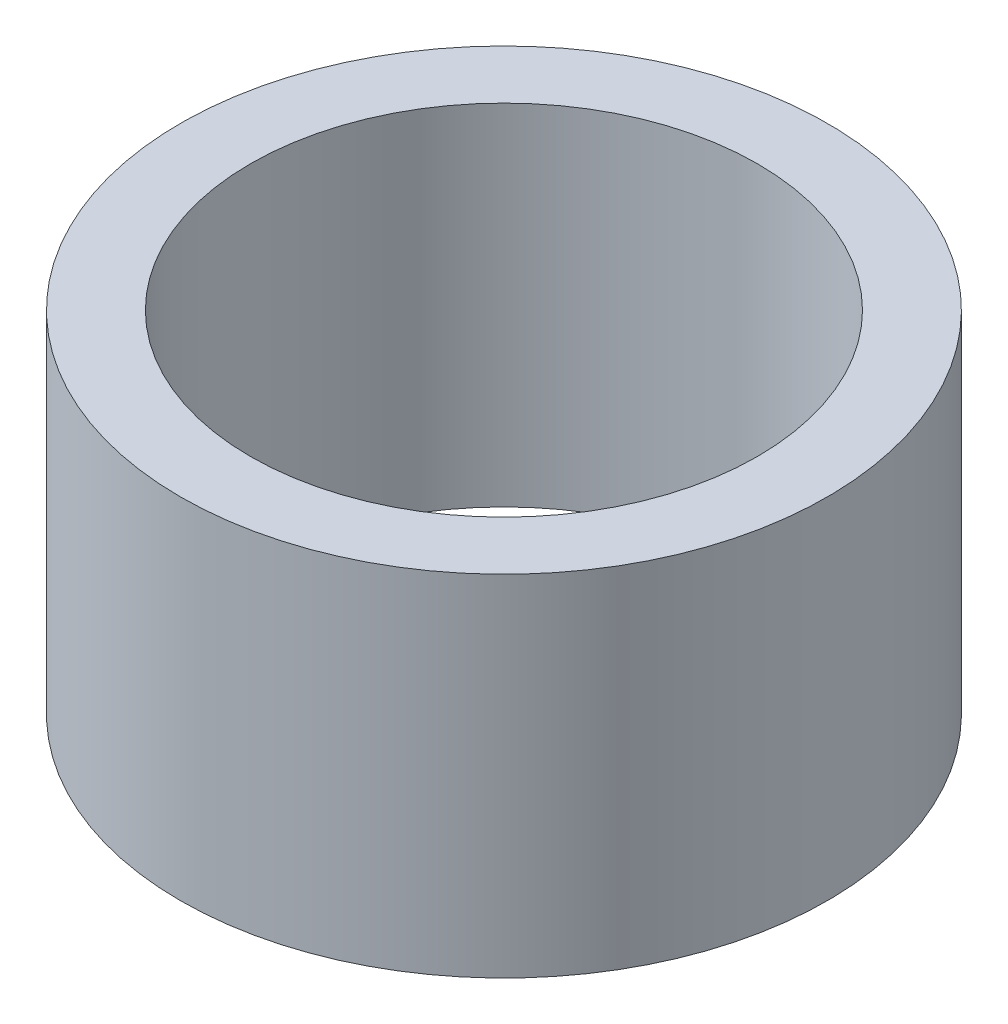
ISO-10303-21;
HEADER;
FILE_DESCRIPTION(('STEP AP214'),'2;1');
FILE_NAME('part.step','',(''),(''),'','','');
FILE_SCHEMA(('AUTOMOTIVE_DESIGN { 1 0 10303 214 1 1 1 1 }'));
ENDSEC;
DATA;
#1=APPLICATION_CONTEXT('core data for automotive mechanical design processes');
#2=APPLICATION_PROTOCOL_DEFINITION('international standard','automotive_design',2000,#1);
#3=PRODUCT_CONTEXT('',#1,'mechanical');
#4=PRODUCT('Part','Part','',(#3));
#5=PRODUCT_RELATED_PRODUCT_CATEGORY('part','',(#4));
#6=PRODUCT_DEFINITION_FORMATION('','',#4);
#7=PRODUCT_DEFINITION_CONTEXT('part definition',#1,'design');
#8=PRODUCT_DEFINITION('design','',#6,#7);
#9=PRODUCT_DEFINITION_SHAPE('','',#8);
#10=(LENGTH_UNIT() NAMED_UNIT(*) SI_UNIT(.MILLI.,.METRE.));
#11=(NAMED_UNIT(*) PLANE_ANGLE_UNIT() SI_UNIT($,.RADIAN.));
#12=(NAMED_UNIT(*) SI_UNIT($,.STERADIAN.) SOLID_ANGLE_UNIT());
#13=UNCERTAINTY_MEASURE_WITH_UNIT(LENGTH_MEASURE(1.E-05),#10,'distance_accuracy_value','');
#14=(GEOMETRIC_REPRESENTATION_CONTEXT(3) GLOBAL_UNCERTAINTY_ASSIGNED_CONTEXT((#13)) GLOBAL_UNIT_ASSIGNED_CONTEXT((#10,
#11,#12)) REPRESENTATION_CONTEXT('',''));
#15=CARTESIAN_POINT('',(0.,0.,0.));
#16=DIRECTION('',(0.,0.,1.));
#17=DIRECTION('',(1.,0.,0.));
#18=AXIS2_PLACEMENT_3D('',#15,#16,#17);
#19=CARTESIAN_POINT('',(0.,20.,0.));
#20=DIRECTION('',(0.,1.,0.));
#21=DIRECTION('',(0.,0.,1.));
#22=AXIS2_PLACEMENT_3D('',#19,#20,#21);
#23=PLANE('',#22);
#24=CARTESIAN_POINT('',(0.,20.,0.));
#25=DIRECTION('',(0.,1.,0.));
#26=DIRECTION('',(0.,0.,1.));
#27=AXIS2_PLACEMENT_3D('',#24,#25,#26);
#28=CIRCLE('',#27,18.5);
#29=CARTESIAN_POINT('',(0.,20.,18.5));
#30=VERTEX_POINT('',#29);
#31=EDGE_CURVE('E10',#30,#30,#28,.T.);
#32=ORIENTED_EDGE('',*,*,#31,.T.);
#33=EDGE_LOOP('',(#32));
#34=FACE_BOUND('',#33,.T.);
#35=CARTESIAN_POINT('',(0.,20.,0.));
#36=DIRECTION('',(0.,1.,0.));
#37=DIRECTION('',(0.,0.,1.));
#38=AXIS2_PLACEMENT_3D('',#35,#36,#37);
#39=CIRCLE('',#38,14.5);
#40=CARTESIAN_POINT('',(0.,20.,14.5));
#41=VERTEX_POINT('',#40);
#42=EDGE_CURVE('E50',#41,#41,#39,.T.);
#43=ORIENTED_EDGE('',*,*,#42,.F.);
#44=EDGE_LOOP('',(#43));
#45=FACE_BOUND('',#44,.T.);
#46=ADVANCED_FACE('F39',(#34,#45),#23,.T.);
#47=CARTESIAN_POINT('',(0.,0.,0.));
#48=DIRECTION('',(0.,1.,0.));
#49=DIRECTION('',(0.,0.,1.));
#50=AXIS2_PLACEMENT_3D('',#47,#48,#49);
#51=PLANE('',#50);
#52=CARTESIAN_POINT('',(0.,0.,0.));
#53=DIRECTION('',(0.,1.,0.));
#54=DIRECTION('',(0.,0.,1.));
#55=AXIS2_PLACEMENT_3D('',#52,#53,#54);
#56=CIRCLE('',#55,18.5);
#57=CARTESIAN_POINT('',(0.,0.,18.5));
#58=VERTEX_POINT('',#57);
#59=EDGE_CURVE('E43',#58,#58,#56,.T.);
#60=ORIENTED_EDGE('',*,*,#59,.F.);
#61=EDGE_LOOP('',(#60));
#62=FACE_BOUND('',#61,.T.);
#63=CARTESIAN_POINT('',(0.,0.,0.));
#64=DIRECTION('',(0.,1.,0.));
#65=DIRECTION('',(0.,0.,1.));
#66=AXIS2_PLACEMENT_3D('',#63,#64,#65);
#67=CIRCLE('',#66,14.5);
#68=CARTESIAN_POINT('',(0.,0.,14.5));
#69=VERTEX_POINT('',#68);
#70=EDGE_CURVE('E52',#69,#69,#67,.T.);
#71=ORIENTED_EDGE('',*,*,#70,.T.);
#72=EDGE_LOOP('',(#71));
#73=FACE_BOUND('',#72,.T.);
#74=ADVANCED_FACE('F62',(#62,#73),#51,.F.);
#75=CARTESIAN_POINT('',(0.,20.,0.));
#76=DIRECTION('',(0.,-1.,0.));
#77=DIRECTION('',(0.,0.,-1.));
#78=AXIS2_PLACEMENT_3D('',#75,#76,#77);
#79=CYLINDRICAL_SURFACE('',#78,18.5);
#80=ORIENTED_EDGE('',*,*,#31,.F.);
#81=EDGE_LOOP('',(#80));
#82=FACE_BOUND('',#81,.T.);
#83=ORIENTED_EDGE('',*,*,#59,.T.);
#84=EDGE_LOOP('',(#83));
#85=FACE_BOUND('',#84,.T.);
#86=ADVANCED_FACE('F41',(#82,#85),#79,.T.);
#87=CARTESIAN_POINT('',(0.,20.,0.));
#88=DIRECTION('',(0.,-1.,0.));
#89=DIRECTION('',(0.,0.,-1.));
#90=AXIS2_PLACEMENT_3D('',#87,#88,#89);
#91=CYLINDRICAL_SURFACE('',#90,14.5);
#92=ORIENTED_EDGE('',*,*,#42,.T.);
#93=EDGE_LOOP('',(#92));
#94=FACE_BOUND('',#93,.T.);
#95=ORIENTED_EDGE('',*,*,#70,.F.);
#96=EDGE_LOOP('',(#95));
#97=FACE_BOUND('',#96,.T.);
#98=ADVANCED_FACE('F58',(#94,#97),#91,.F.);
#99=CLOSED_SHELL('',(#46,#74,#86,#98));
#100=MANIFOLD_SOLID_BREP('B2',#99);
#101=ADVANCED_BREP_SHAPE_REPRESENTATION('',(#18,#100),#14);
#102=SHAPE_DEFINITION_REPRESENTATION(#9,#101);
ENDSEC;
END-ISO-10303-21;
